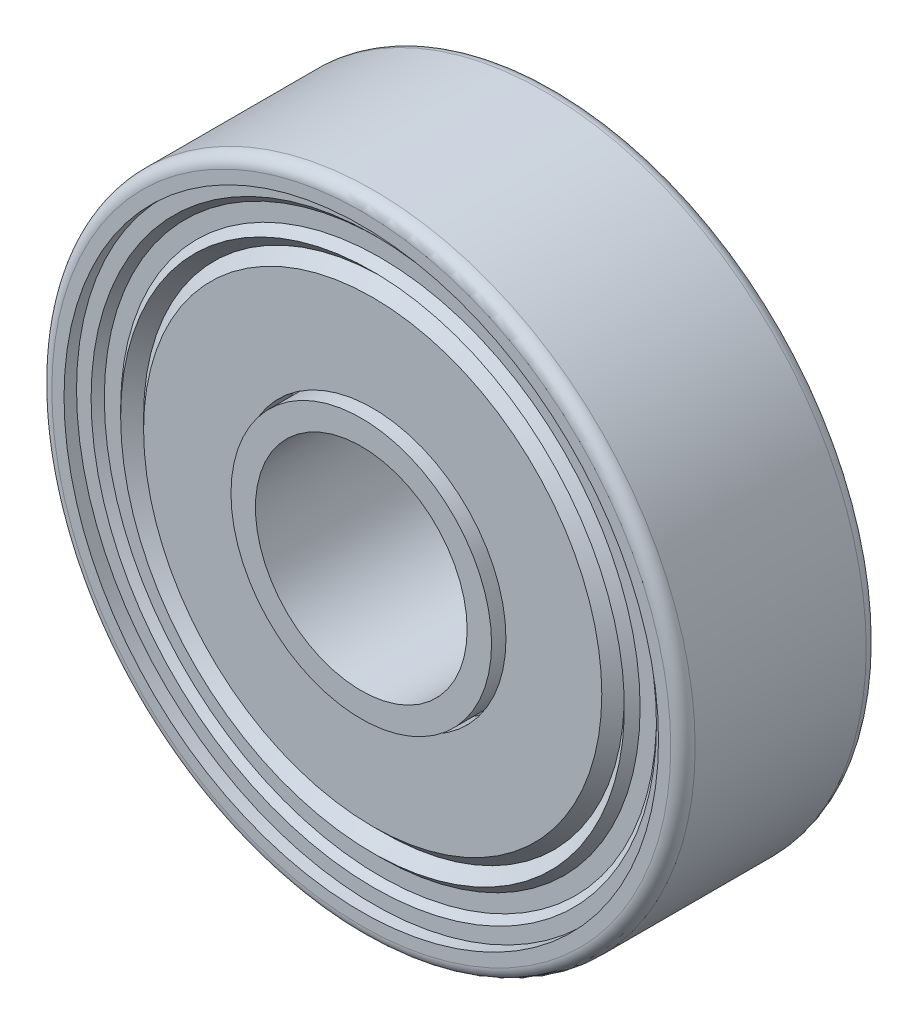
ISO-10303-21;
HEADER;
FILE_DESCRIPTION(('STEP AP214'),'2;1');
FILE_NAME('part.step','',(''),(''),'','','');
FILE_SCHEMA(('AUTOMOTIVE_DESIGN { 1 0 10303 214 1 1 1 1 }'));
ENDSEC;
DATA;
#1=APPLICATION_CONTEXT('core data for automotive mechanical design processes');
#2=APPLICATION_PROTOCOL_DEFINITION('international standard','automotive_design',2000,#1);
#3=PRODUCT_CONTEXT('',#1,'mechanical');
#4=PRODUCT('Part','Part','',(#3));
#5=PRODUCT_RELATED_PRODUCT_CATEGORY('part','',(#4));
#6=PRODUCT_DEFINITION_FORMATION('','',#4);
#7=PRODUCT_DEFINITION_CONTEXT('part definition',#1,'design');
#8=PRODUCT_DEFINITION('design','',#6,#7);
#9=PRODUCT_DEFINITION_SHAPE('','',#8);
#10=(LENGTH_UNIT() NAMED_UNIT(*) SI_UNIT(.MILLI.,.METRE.));
#11=(NAMED_UNIT(*) PLANE_ANGLE_UNIT() SI_UNIT($,.RADIAN.));
#12=(NAMED_UNIT(*) SI_UNIT($,.STERADIAN.) SOLID_ANGLE_UNIT());
#13=UNCERTAINTY_MEASURE_WITH_UNIT(LENGTH_MEASURE(1.E-05),#10,'distance_accuracy_value','');
#14=(GEOMETRIC_REPRESENTATION_CONTEXT(3) GLOBAL_UNCERTAINTY_ASSIGNED_CONTEXT((#13)) GLOBAL_UNIT_ASSIGNED_CONTEXT((#10,
#11,#12)) REPRESENTATION_CONTEXT('',''));
#15=CARTESIAN_POINT('',(0.,0.,0.));
#16=DIRECTION('',(0.,0.,1.));
#17=DIRECTION('',(1.,0.,0.));
#18=AXIS2_PLACEMENT_3D('',#15,#16,#17);
#19=CARTESIAN_POINT('',(0.,0.,0.));
#20=DIRECTION('',(0.,0.,1.));
#21=DIRECTION('',(1.,0.,0.));
#22=AXIS2_PLACEMENT_3D('',#19,#20,#21);
#23=PLANE('',#22);
#24=CARTESIAN_POINT('',(0.,0.,0.));
#25=DIRECTION('',(0.,0.,1.));
#26=DIRECTION('',(1.,0.,0.));
#27=AXIS2_PLACEMENT_3D('',#24,#25,#26);
#28=CIRCLE('',#27,7.6);
#29=CARTESIAN_POINT('',(7.6,0.,0.));
#30=VERTEX_POINT('',#29);
#31=EDGE_CURVE('E10',#30,#30,#28,.F.);
#32=ORIENTED_EDGE('',*,*,#31,.T.);
#33=EDGE_LOOP('',(#32));
#34=FACE_BOUND('',#33,.T.);
#35=CARTESIAN_POINT('',(0.,0.,0.));
#36=DIRECTION('',(0.,0.,1.));
#37=DIRECTION('',(1.,0.,0.));
#38=AXIS2_PLACEMENT_3D('',#35,#36,#37);
#39=CIRCLE('',#38,7.3);
#40=CARTESIAN_POINT('',(7.3,0.,0.));
#41=VERTEX_POINT('',#40);
#42=EDGE_CURVE('E65',#41,#41,#39,.T.);
#43=ORIENTED_EDGE('',*,*,#42,.T.);
#44=EDGE_LOOP('',(#43));
#45=FACE_BOUND('',#44,.T.);
#46=ADVANCED_FACE('F40',(#34,#45),#23,.F.);
#47=CARTESIAN_POINT('',(0.,0.,0.));
#48=DIRECTION('',(0.,0.,1.));
#49=DIRECTION('',(1.,0.,0.));
#50=AXIS2_PLACEMENT_3D('',#47,#48,#49);
#51=CIRCLE('',#50,2.6);
#52=CARTESIAN_POINT('',(2.6,0.,0.));
#53=VERTEX_POINT('',#52);
#54=EDGE_CURVE('E79',#53,#53,#51,.T.);
#55=ORIENTED_EDGE('',*,*,#54,.T.);
#56=EDGE_LOOP('',(#55));
#57=FACE_BOUND('',#56,.T.);
#58=CARTESIAN_POINT('',(0.,0.,0.));
#59=DIRECTION('',(0.,0.,1.));
#60=DIRECTION('',(1.,0.,0.));
#61=AXIS2_PLACEMENT_3D('',#58,#59,#60);
#62=CIRCLE('',#61,3.2);
#63=CARTESIAN_POINT('',(3.2,0.,0.));
#64=VERTEX_POINT('',#63);
#65=EDGE_CURVE('E70',#64,#64,#62,.F.);
#66=ORIENTED_EDGE('',*,*,#65,.T.);
#67=EDGE_LOOP('',(#66));
#68=FACE_BOUND('',#67,.T.);
#69=ADVANCED_FACE('F188',(#57,#68),#23,.F.);
#70=CARTESIAN_POINT('',(0.,0.,4.8));
#71=DIRECTION('',(0.,0.,1.));
#72=DIRECTION('',(1.,0.,0.));
#73=AXIS2_PLACEMENT_3D('',#70,#71,#72);
#74=PLANE('',#73);
#75=CARTESIAN_POINT('',(0.,0.,4.8));
#76=DIRECTION('',(0.,0.,1.));
#77=DIRECTION('',(1.,0.,0.));
#78=AXIS2_PLACEMENT_3D('',#75,#76,#77);
#79=CIRCLE('',#78,7.6);
#80=CARTESIAN_POINT('',(7.6,0.,4.8));
#81=VERTEX_POINT('',#80);
#82=EDGE_CURVE('E58',#81,#81,#79,.T.);
#83=ORIENTED_EDGE('',*,*,#82,.T.);
#84=EDGE_LOOP('',(#83));
#85=FACE_BOUND('',#84,.T.);
#86=CARTESIAN_POINT('',(0.,0.,4.8));
#87=DIRECTION('',(0.,0.,1.));
#88=DIRECTION('',(1.,0.,0.));
#89=AXIS2_PLACEMENT_3D('',#86,#87,#88);
#90=CIRCLE('',#89,7.3);
#91=CARTESIAN_POINT('',(7.3,0.,4.8));
#92=VERTEX_POINT('',#91);
#93=EDGE_CURVE('E75',#92,#92,#90,.T.);
#94=ORIENTED_EDGE('',*,*,#93,.F.);
#95=EDGE_LOOP('',(#94));
#96=FACE_BOUND('',#95,.T.);
#97=ADVANCED_FACE('F194',(#85,#96),#74,.T.);
#98=CARTESIAN_POINT('',(0.,0.,4.8));
#99=DIRECTION('',(0.,0.,1.));
#100=DIRECTION('',(1.,0.,0.));
#101=AXIS2_PLACEMENT_3D('',#98,#99,#100);
#102=CIRCLE('',#101,2.6);
#103=CARTESIAN_POINT('',(2.6,0.,4.8));
#104=VERTEX_POINT('',#103);
#105=EDGE_CURVE('E64',#104,#104,#102,.T.);
#106=ORIENTED_EDGE('',*,*,#105,.F.);
#107=EDGE_LOOP('',(#106));
#108=FACE_BOUND('',#107,.T.);
#109=CARTESIAN_POINT('',(0.,0.,4.8));
#110=DIRECTION('',(0.,0.,1.));
#111=DIRECTION('',(1.,0.,0.));
#112=AXIS2_PLACEMENT_3D('',#109,#110,#111);
#113=CIRCLE('',#112,3.2);
#114=CARTESIAN_POINT('',(3.2,0.,4.8));
#115=VERTEX_POINT('',#114);
#116=EDGE_CURVE('E80',#115,#115,#113,.F.);
#117=ORIENTED_EDGE('',*,*,#116,.F.);
#118=EDGE_LOOP('',(#117));
#119=FACE_BOUND('',#118,.T.);
#120=ADVANCED_FACE('F203',(#108,#119),#74,.T.);
#121=CARTESIAN_POINT('',(0.,0.,4.8));
#122=DIRECTION('',(0.,0.,-1.));
#123=DIRECTION('',(-1.,0.,0.));
#124=AXIS2_PLACEMENT_3D('',#121,#122,#123);
#125=CYLINDRICAL_SURFACE('',#124,7.9);
#126=CARTESIAN_POINT('',(0.,0.,4.5));
#127=DIRECTION('',(0.,0.,1.));
#128=DIRECTION('',(1.,0.,0.));
#129=AXIS2_PLACEMENT_3D('',#126,#127,#128);
#130=CIRCLE('',#129,7.9);
#131=CARTESIAN_POINT('',(7.9,0.,4.5));
#132=VERTEX_POINT('',#131);
#133=EDGE_CURVE('E48',#132,#132,#130,.F.);
#134=ORIENTED_EDGE('',*,*,#133,.T.);
#135=EDGE_LOOP('',(#134));
#136=FACE_BOUND('',#135,.T.);
#137=CARTESIAN_POINT('',(0.,0.,0.3));
#138=DIRECTION('',(0.,0.,1.));
#139=DIRECTION('',(1.,0.,0.));
#140=AXIS2_PLACEMENT_3D('',#137,#138,#139);
#141=CIRCLE('',#140,7.9);
#142=CARTESIAN_POINT('',(7.9,0.,0.3));
#143=VERTEX_POINT('',#142);
#144=EDGE_CURVE('E53',#143,#143,#141,.T.);
#145=ORIENTED_EDGE('',*,*,#144,.T.);
#146=EDGE_LOOP('',(#145));
#147=FACE_BOUND('',#146,.T.);
#148=ADVANCED_FACE('F200',(#136,#147),#125,.T.);
#149=CARTESIAN_POINT('',(0.,0.,4.8));
#150=DIRECTION('',(0.,0.,-1.));
#151=DIRECTION('',(-1.,0.,0.));
#152=AXIS2_PLACEMENT_3D('',#149,#150,#151);
#153=CYLINDRICAL_SURFACE('',#152,2.6);
#154=ORIENTED_EDGE('',*,*,#105,.T.);
#155=EDGE_LOOP('',(#154));
#156=FACE_BOUND('',#155,.T.);
#157=ORIENTED_EDGE('',*,*,#54,.F.);
#158=EDGE_LOOP('',(#157));
#159=FACE_BOUND('',#158,.T.);
#160=ADVANCED_FACE('F202',(#156,#159),#153,.F.);
#161=CARTESIAN_POINT('',(0.,0.,4.87973216310469));
#162=DIRECTION('',(0.,0.,-1.));
#163=DIRECTION('',(-1.,0.,0.));
#164=AXIS2_PLACEMENT_3D('',#161,#162,#163);
#165=CYLINDRICAL_SURFACE('',#164,7.3);
#166=ORIENTED_EDGE('',*,*,#93,.T.);
#167=EDGE_LOOP('',(#166));
#168=FACE_BOUND('',#167,.T.);
#169=CARTESIAN_POINT('',(0.,0.,4.49295622621438));
#170=DIRECTION('',(0.,0.,-1.));
#171=DIRECTION('',(-1.,0.,0.));
#172=AXIS2_PLACEMENT_3D('',#169,#170,#171);
#173=CIRCLE('',#172,7.3);
#174=CARTESIAN_POINT('',(-7.3,0.,4.49295622621438));
#175=VERTEX_POINT('',#174);
#176=EDGE_CURVE('E84',#175,#175,#173,.T.);
#177=ORIENTED_EDGE('',*,*,#176,.T.);
#178=EDGE_LOOP('',(#177));
#179=FACE_BOUND('',#178,.T.);
#180=ADVANCED_FACE('F208',(#168,#179),#165,.F.);
#181=CARTESIAN_POINT('',(0.,7.3,4.49295622621438));
#182=DIRECTION('',(0.,0.,-1.));
#183=DIRECTION('',(-1.,0.,0.));
#184=AXIS2_PLACEMENT_3D('',#181,#182,#183);
#185=PLANE('',#184);
#186=ORIENTED_EDGE('',*,*,#176,.F.);
#187=EDGE_LOOP('',(#186));
#188=FACE_BOUND('',#187,.T.);
#189=CARTESIAN_POINT('',(0.,0.,4.49295622621438));
#190=DIRECTION('',(0.,0.,-1.));
#191=DIRECTION('',(-1.,0.,0.));
#192=AXIS2_PLACEMENT_3D('',#189,#190,#191);
#193=CIRCLE('',#192,6.94265262737443);
#194=CARTESIAN_POINT('',(-6.94265262737443,0.,4.49295622621438));
#195=VERTEX_POINT('',#194);
#196=EDGE_CURVE('E94',#195,#195,#193,.T.);
#197=ORIENTED_EDGE('',*,*,#196,.T.);
#198=EDGE_LOOP('',(#197));
#199=FACE_BOUND('',#198,.T.);
#200=ADVANCED_FACE('F446',(#188,#199),#185,.F.);
#201=CARTESIAN_POINT('',(0.,0.,4.33057613093863));
#202=DIRECTION('',(0.,0.,1.));
#203=DIRECTION('',(1.,0.,0.));
#204=AXIS2_PLACEMENT_3D('',#201,#202,#203);
#205=CONICAL_SURFACE('',#204,6.78027253209868,0.785398163397448);
#206=ORIENTED_EDGE('',*,*,#196,.F.);
#207=EDGE_LOOP('',(#206));
#208=FACE_BOUND('',#207,.T.);
#209=CARTESIAN_POINT('',(0.,0.,4.33057613093863));
#210=DIRECTION('',(0.,0.,-1.));
#211=DIRECTION('',(-1.,0.,0.));
#212=AXIS2_PLACEMENT_3D('',#209,#210,#211);
#213=CIRCLE('',#212,6.78027253209868);
#214=CARTESIAN_POINT('',(-6.78027253209868,0.,4.33057613093863));
#215=VERTEX_POINT('',#214);
#216=EDGE_CURVE('E98',#215,#215,#213,.T.);
#217=ORIENTED_EDGE('',*,*,#216,.T.);
#218=EDGE_LOOP('',(#217));
#219=FACE_BOUND('',#218,.T.);
#220=ADVANCED_FACE('F435',(#208,#219),#205,.F.);
#221=CARTESIAN_POINT('',(0.,6.78027253209868,4.33057613093863));
#222=DIRECTION('',(0.,0.,-1.));
#223=DIRECTION('',(-1.,0.,0.));
#224=AXIS2_PLACEMENT_3D('',#221,#222,#223);
#225=PLANE('',#224);
#226=ORIENTED_EDGE('',*,*,#216,.F.);
#227=EDGE_LOOP('',(#226));
#228=FACE_BOUND('',#227,.T.);
#229=CARTESIAN_POINT('',(0.,0.,4.33057613093863));
#230=DIRECTION('',(0.,0.,-1.));
#231=DIRECTION('',(-1.,0.,0.));
#232=AXIS2_PLACEMENT_3D('',#229,#230,#231);
#233=CIRCLE('',#232,6.37895832394229);
#234=CARTESIAN_POINT('',(-6.37895832394229,0.,4.33057613093863));
#235=VERTEX_POINT('',#234);
#236=EDGE_CURVE('E102',#235,#235,#233,.T.);
#237=ORIENTED_EDGE('',*,*,#236,.T.);
#238=EDGE_LOOP('',(#237));
#239=FACE_BOUND('',#238,.T.);
#240=ADVANCED_FACE('F424',(#228,#239),#225,.F.);
#241=CARTESIAN_POINT('',(0.,0.,4.52407841678198));
#242=DIRECTION('',(0.,0.,-1.));
#243=DIRECTION('',(-1.,0.,0.));
#244=AXIS2_PLACEMENT_3D('',#241,#242,#243);
#245=CONICAL_SURFACE('',#244,6.18545603809894,0.785398163397448);
#246=ORIENTED_EDGE('',*,*,#236,.F.);
#247=EDGE_LOOP('',(#246));
#248=FACE_BOUND('',#247,.T.);
#249=CARTESIAN_POINT('',(0.,0.,4.52407841678198));
#250=DIRECTION('',(0.,0.,-1.));
#251=DIRECTION('',(-1.,0.,0.));
#252=AXIS2_PLACEMENT_3D('',#249,#250,#251);
#253=CIRCLE('',#252,6.18545603809894);
#254=CARTESIAN_POINT('',(-6.18545603809894,0.,4.52407841678198));
#255=VERTEX_POINT('',#254);
#256=EDGE_CURVE('E106',#255,#255,#253,.T.);
#257=ORIENTED_EDGE('',*,*,#256,.T.);
#258=EDGE_LOOP('',(#257));
#259=FACE_BOUND('',#258,.T.);
#260=ADVANCED_FACE('F413',(#248,#259),#245,.T.);
#261=CARTESIAN_POINT('',(0.,0.,4.24238655349189));
#262=DIRECTION('',(0.,0.,1.));
#263=DIRECTION('',(1.,0.,0.));
#264=AXIS2_PLACEMENT_3D('',#261,#262,#263);
#265=CONICAL_SURFACE('',#264,5.90376417480886,0.785398163397448);
#266=ORIENTED_EDGE('',*,*,#256,.F.);
#267=EDGE_LOOP('',(#266));
#268=FACE_BOUND('',#267,.T.);
#269=CARTESIAN_POINT('',(0.,0.,4.24238655349189));
#270=DIRECTION('',(0.,0.,-1.));
#271=DIRECTION('',(-1.,0.,0.));
#272=AXIS2_PLACEMENT_3D('',#269,#270,#271);
#273=CIRCLE('',#272,5.90376417480886);
#274=CARTESIAN_POINT('',(-5.90376417480886,0.,4.24238655349189));
#275=VERTEX_POINT('',#274);
#276=EDGE_CURVE('E110',#275,#275,#273,.T.);
#277=ORIENTED_EDGE('',*,*,#276,.T.);
#278=EDGE_LOOP('',(#277));
#279=FACE_BOUND('',#278,.T.);
#280=ADVANCED_FACE('F402',(#268,#279),#265,.F.);
#281=CARTESIAN_POINT('',(0.,0.,4.51962984693023));
#282=DIRECTION('',(0.,0.,-1.));
#283=DIRECTION('',(-1.,0.,0.));
#284=AXIS2_PLACEMENT_3D('',#281,#282,#283);
#285=CONICAL_SURFACE('',#284,5.62652088137051,0.78539816339745);
#286=ORIENTED_EDGE('',*,*,#276,.F.);
#287=EDGE_LOOP('',(#286));
#288=FACE_BOUND('',#287,.T.);
#289=CARTESIAN_POINT('',(0.,0.,4.51962984693023));
#290=DIRECTION('',(0.,0.,-1.));
#291=DIRECTION('',(-1.,0.,0.));
#292=AXIS2_PLACEMENT_3D('',#289,#290,#291);
#293=CIRCLE('',#292,5.62652088137051);
#294=CARTESIAN_POINT('',(-5.62652088137051,0.,4.51962984693023));
#295=VERTEX_POINT('',#294);
#296=EDGE_CURVE('E114',#295,#295,#293,.T.);
#297=ORIENTED_EDGE('',*,*,#296,.T.);
#298=EDGE_LOOP('',(#297));
#299=FACE_BOUND('',#298,.T.);
#300=ADVANCED_FACE('F391',(#288,#299),#285,.T.);
#301=CARTESIAN_POINT('',(0.,5.62652088137051,4.51962984693023));
#302=DIRECTION('',(0.,0.,-1.));
#303=DIRECTION('',(-1.,0.,0.));
#304=AXIS2_PLACEMENT_3D('',#301,#302,#303);
#305=PLANE('',#304);
#306=ORIENTED_EDGE('',*,*,#296,.F.);
#307=EDGE_LOOP('',(#306));
#308=FACE_BOUND('',#307,.T.);
#309=CARTESIAN_POINT('',(0.,0.,4.51962984693023));
#310=DIRECTION('',(0.,0.,-1.));
#311=DIRECTION('',(-1.,0.,0.));
#312=AXIS2_PLACEMENT_3D('',#309,#310,#311);
#313=CIRCLE('',#312,3.27293966677261);
#314=CARTESIAN_POINT('',(-3.27293966677261,0.,4.51962984693023));
#315=VERTEX_POINT('',#314);
#316=EDGE_CURVE('E118',#315,#315,#313,.T.);
#317=ORIENTED_EDGE('',*,*,#316,.T.);
#318=EDGE_LOOP('',(#317));
#319=FACE_BOUND('',#318,.T.);
#320=ADVANCED_FACE('F380',(#308,#319),#305,.F.);
#321=CARTESIAN_POINT('',(0.,0.,4.87973216310469));
#322=DIRECTION('',(0.,0.,-1.));
#323=DIRECTION('',(-1.,0.,0.));
#324=AXIS2_PLACEMENT_3D('',#321,#322,#323);
#325=CYLINDRICAL_SURFACE('',#324,3.27293966677261);
#326=ORIENTED_EDGE('',*,*,#316,.F.);
#327=EDGE_LOOP('',(#326));
#328=FACE_BOUND('',#327,.T.);
#329=CARTESIAN_POINT('',(0.,0.,3.81743033039006));
#330=DIRECTION('',(0.,0.,-1.));
#331=DIRECTION('',(-1.,0.,0.));
#332=AXIS2_PLACEMENT_3D('',#329,#330,#331);
#333=CIRCLE('',#332,3.27293966677261);
#334=CARTESIAN_POINT('',(-3.27293966677261,0.,3.81743033039006));
#335=VERTEX_POINT('',#334);
#336=EDGE_CURVE('E122',#335,#335,#333,.T.);
#337=ORIENTED_EDGE('',*,*,#336,.T.);
#338=EDGE_LOOP('',(#337));
#339=FACE_BOUND('',#338,.T.);
#340=ADVANCED_FACE('F369',(#328,#339),#325,.F.);
#341=CARTESIAN_POINT('',(0.,3.27293966677261,3.81743033039006));
#342=DIRECTION('',(0.,0.,-1.));
#343=DIRECTION('',(-1.,0.,0.));
#344=AXIS2_PLACEMENT_3D('',#341,#342,#343);
#345=PLANE('',#344);
#346=ORIENTED_EDGE('',*,*,#336,.F.);
#347=EDGE_LOOP('',(#346));
#348=FACE_BOUND('',#347,.T.);
#349=CARTESIAN_POINT('',(0.,0.,3.81743033039006));
#350=DIRECTION('',(0.,0.,-1.));
#351=DIRECTION('',(-1.,0.,0.));
#352=AXIS2_PLACEMENT_3D('',#349,#350,#351);
#353=CIRCLE('',#352,3.2);
#354=CARTESIAN_POINT('',(-3.2,0.,3.81743033039006));
#355=VERTEX_POINT('',#354);
#356=EDGE_CURVE('E69',#355,#355,#353,.T.);
#357=ORIENTED_EDGE('',*,*,#356,.T.);
#358=EDGE_LOOP('',(#357));
#359=FACE_BOUND('',#358,.T.);
#360=ADVANCED_FACE('F359',(#348,#359),#345,.F.);
#361=CARTESIAN_POINT('',(0.,0.,4.87973216310469));
#362=DIRECTION('',(0.,0.,-1.));
#363=DIRECTION('',(-1.,0.,0.));
#364=AXIS2_PLACEMENT_3D('',#361,#362,#363);
#365=CYLINDRICAL_SURFACE('',#364,3.2);
#366=ORIENTED_EDGE('',*,*,#116,.T.);
#367=EDGE_LOOP('',(#366));
#368=FACE_BOUND('',#367,.T.);
#369=ORIENTED_EDGE('',*,*,#356,.F.);
#370=EDGE_LOOP('',(#369));
#371=FACE_BOUND('',#370,.T.);
#372=ADVANCED_FACE('F337',(#368,#371),#365,.T.);
#373=CARTESIAN_POINT('',(0.,0.,-0.0797321631046876));
#374=DIRECTION('',(0.,0.,1.));
#375=DIRECTION('',(-1.,0.,0.));
#376=AXIS2_PLACEMENT_3D('',#373,#374,#375);
#377=CYLINDRICAL_SURFACE('',#376,7.3);
#378=CARTESIAN_POINT('',(0.,0.,0.307043773785621));
#379=DIRECTION('',(0.,0.,-1.));
#380=DIRECTION('',(-1.,0.,0.));
#381=AXIS2_PLACEMENT_3D('',#378,#379,#380);
#382=CIRCLE('',#381,7.3);
#383=CARTESIAN_POINT('',(-7.3,0.,0.307043773785621));
#384=VERTEX_POINT('',#383);
#385=EDGE_CURVE('E74',#384,#384,#382,.T.);
#386=ORIENTED_EDGE('',*,*,#385,.F.);
#387=EDGE_LOOP('',(#386));
#388=FACE_BOUND('',#387,.T.);
#389=ORIENTED_EDGE('',*,*,#42,.F.);
#390=EDGE_LOOP('',(#389));
#391=FACE_BOUND('',#390,.T.);
#392=ADVANCED_FACE('F328',(#388,#391),#377,.F.);
#393=CARTESIAN_POINT('',(0.,0.,-0.0797321631046876));
#394=DIRECTION('',(0.,0.,1.));
#395=DIRECTION('',(-1.,0.,0.));
#396=AXIS2_PLACEMENT_3D('',#393,#394,#395);
#397=CYLINDRICAL_SURFACE('',#396,3.2);
#398=CARTESIAN_POINT('',(0.,0.,0.982569669609943));
#399=DIRECTION('',(0.,0.,-1.));
#400=DIRECTION('',(-1.,0.,0.));
#401=AXIS2_PLACEMENT_3D('',#398,#399,#400);
#402=CIRCLE('',#401,3.2);
#403=CARTESIAN_POINT('',(-3.2,0.,0.982569669609943));
#404=VERTEX_POINT('',#403);
#405=EDGE_CURVE('E164',#404,#404,#402,.T.);
#406=ORIENTED_EDGE('',*,*,#405,.T.);
#407=EDGE_LOOP('',(#406));
#408=FACE_BOUND('',#407,.T.);
#409=ORIENTED_EDGE('',*,*,#65,.F.);
#410=EDGE_LOOP('',(#409));
#411=FACE_BOUND('',#410,.T.);
#412=ADVANCED_FACE('F169',(#408,#411),#397,.T.);
#413=CARTESIAN_POINT('',(0.,7.3,0.307043773785621));
#414=DIRECTION('',(0.,0.,1.));
#415=DIRECTION('',(-1.,0.,0.));
#416=AXIS2_PLACEMENT_3D('',#413,#414,#415);
#417=PLANE('',#416);
#418=ORIENTED_EDGE('',*,*,#385,.T.);
#419=EDGE_LOOP('',(#418));
#420=FACE_BOUND('',#419,.T.);
#421=CARTESIAN_POINT('',(0.,0.,0.307043773785621));
#422=DIRECTION('',(0.,0.,-1.));
#423=DIRECTION('',(-1.,0.,0.));
#424=AXIS2_PLACEMENT_3D('',#421,#422,#423);
#425=CIRCLE('',#424,6.94265262737443);
#426=CARTESIAN_POINT('',(-6.94265262737443,0.,0.307043773785621));
#427=VERTEX_POINT('',#426);
#428=EDGE_CURVE('E132',#427,#427,#425,.T.);
#429=ORIENTED_EDGE('',*,*,#428,.F.);
#430=EDGE_LOOP('',(#429));
#431=FACE_BOUND('',#430,.T.);
#432=ADVANCED_FACE('F307',(#420,#431),#417,.F.);
#433=CARTESIAN_POINT('',(0.,0.,0.469423869061368));
#434=DIRECTION('',(0.,0.,-1.));
#435=DIRECTION('',(1.,0.,0.));
#436=AXIS2_PLACEMENT_3D('',#433,#434,#435);
#437=CONICAL_SURFACE('',#436,6.78027253209868,0.785398163397448);
#438=ORIENTED_EDGE('',*,*,#428,.T.);
#439=EDGE_LOOP('',(#438));
#440=FACE_BOUND('',#439,.T.);
#441=CARTESIAN_POINT('',(0.,0.,0.469423869061368));
#442=DIRECTION('',(0.,0.,-1.));
#443=DIRECTION('',(-1.,0.,0.));
#444=AXIS2_PLACEMENT_3D('',#441,#442,#443);
#445=CIRCLE('',#444,6.78027253209868);
#446=CARTESIAN_POINT('',(-6.78027253209868,0.,0.469423869061368));
#447=VERTEX_POINT('',#446);
#448=EDGE_CURVE('E136',#447,#447,#445,.T.);
#449=ORIENTED_EDGE('',*,*,#448,.F.);
#450=EDGE_LOOP('',(#449));
#451=FACE_BOUND('',#450,.T.);
#452=ADVANCED_FACE('F296',(#440,#451),#437,.F.);
#453=CARTESIAN_POINT('',(0.,6.78027253209868,0.469423869061368));
#454=DIRECTION('',(0.,0.,1.));
#455=DIRECTION('',(-1.,0.,0.));
#456=AXIS2_PLACEMENT_3D('',#453,#454,#455);
#457=PLANE('',#456);
#458=ORIENTED_EDGE('',*,*,#448,.T.);
#459=EDGE_LOOP('',(#458));
#460=FACE_BOUND('',#459,.T.);
#461=CARTESIAN_POINT('',(0.,0.,0.469423869061368));
#462=DIRECTION('',(0.,0.,-1.));
#463=DIRECTION('',(-1.,0.,0.));
#464=AXIS2_PLACEMENT_3D('',#461,#462,#463);
#465=CIRCLE('',#464,6.37895832394229);
#466=CARTESIAN_POINT('',(-6.37895832394229,0.,0.469423869061368));
#467=VERTEX_POINT('',#466);
#468=EDGE_CURVE('E140',#467,#467,#465,.T.);
#469=ORIENTED_EDGE('',*,*,#468,.F.);
#470=EDGE_LOOP('',(#469));
#471=FACE_BOUND('',#470,.T.);
#472=ADVANCED_FACE('F285',(#460,#471),#457,.F.);
#473=CARTESIAN_POINT('',(0.,0.,0.275921583218019));
#474=DIRECTION('',(0.,0.,1.));
#475=DIRECTION('',(-1.,0.,0.));
#476=AXIS2_PLACEMENT_3D('',#473,#474,#475);
#477=CONICAL_SURFACE('',#476,6.18545603809894,0.785398163397448);
#478=ORIENTED_EDGE('',*,*,#468,.T.);
#479=EDGE_LOOP('',(#478));
#480=FACE_BOUND('',#479,.T.);
#481=CARTESIAN_POINT('',(0.,0.,0.275921583218019));
#482=DIRECTION('',(0.,0.,-1.));
#483=DIRECTION('',(-1.,0.,0.));
#484=AXIS2_PLACEMENT_3D('',#481,#482,#483);
#485=CIRCLE('',#484,6.18545603809894);
#486=CARTESIAN_POINT('',(-6.18545603809894,0.,0.275921583218019));
#487=VERTEX_POINT('',#486);
#488=EDGE_CURVE('E144',#487,#487,#485,.T.);
#489=ORIENTED_EDGE('',*,*,#488,.F.);
#490=EDGE_LOOP('',(#489));
#491=FACE_BOUND('',#490,.T.);
#492=ADVANCED_FACE('F274',(#480,#491),#477,.T.);
#493=CARTESIAN_POINT('',(0.,0.,0.557613446508106));
#494=DIRECTION('',(0.,0.,-1.));
#495=DIRECTION('',(1.,0.,0.));
#496=AXIS2_PLACEMENT_3D('',#493,#494,#495);
#497=CONICAL_SURFACE('',#496,5.90376417480886,0.785398163397448);
#498=ORIENTED_EDGE('',*,*,#488,.T.);
#499=EDGE_LOOP('',(#498));
#500=FACE_BOUND('',#499,.T.);
#501=CARTESIAN_POINT('',(0.,0.,0.557613446508106));
#502=DIRECTION('',(0.,0.,-1.));
#503=DIRECTION('',(-1.,0.,0.));
#504=AXIS2_PLACEMENT_3D('',#501,#502,#503);
#505=CIRCLE('',#504,5.90376417480886);
#506=CARTESIAN_POINT('',(-5.90376417480886,0.,0.557613446508106));
#507=VERTEX_POINT('',#506);
#508=EDGE_CURVE('E148',#507,#507,#505,.T.);
#509=ORIENTED_EDGE('',*,*,#508,.F.);
#510=EDGE_LOOP('',(#509));
#511=FACE_BOUND('',#510,.T.);
#512=ADVANCED_FACE('F263',(#500,#511),#497,.F.);
#513=CARTESIAN_POINT('',(0.,0.,0.280370153069765));
#514=DIRECTION('',(0.,0.,1.));
#515=DIRECTION('',(-1.,0.,0.));
#516=AXIS2_PLACEMENT_3D('',#513,#514,#515);
#517=CONICAL_SURFACE('',#516,5.62652088137051,0.78539816339745);
#518=ORIENTED_EDGE('',*,*,#508,.T.);
#519=EDGE_LOOP('',(#518));
#520=FACE_BOUND('',#519,.T.);
#521=CARTESIAN_POINT('',(0.,0.,0.280370153069765));
#522=DIRECTION('',(0.,0.,-1.));
#523=DIRECTION('',(-1.,0.,0.));
#524=AXIS2_PLACEMENT_3D('',#521,#522,#523);
#525=CIRCLE('',#524,5.62652088137051);
#526=CARTESIAN_POINT('',(-5.62652088137051,0.,0.280370153069765));
#527=VERTEX_POINT('',#526);
#528=EDGE_CURVE('E152',#527,#527,#525,.T.);
#529=ORIENTED_EDGE('',*,*,#528,.F.);
#530=EDGE_LOOP('',(#529));
#531=FACE_BOUND('',#530,.T.);
#532=ADVANCED_FACE('F252',(#520,#531),#517,.T.);
#533=CARTESIAN_POINT('',(0.,5.62652088137051,0.280370153069765));
#534=DIRECTION('',(0.,0.,1.));
#535=DIRECTION('',(-1.,0.,0.));
#536=AXIS2_PLACEMENT_3D('',#533,#534,#535);
#537=PLANE('',#536);
#538=ORIENTED_EDGE('',*,*,#528,.T.);
#539=EDGE_LOOP('',(#538));
#540=FACE_BOUND('',#539,.T.);
#541=CARTESIAN_POINT('',(0.,0.,0.280370153069765));
#542=DIRECTION('',(0.,0.,-1.));
#543=DIRECTION('',(-1.,0.,0.));
#544=AXIS2_PLACEMENT_3D('',#541,#542,#543);
#545=CIRCLE('',#544,3.27293966677261);
#546=CARTESIAN_POINT('',(-3.27293966677261,0.,0.280370153069765));
#547=VERTEX_POINT('',#546);
#548=EDGE_CURVE('E156',#547,#547,#545,.T.);
#549=ORIENTED_EDGE('',*,*,#548,.F.);
#550=EDGE_LOOP('',(#549));
#551=FACE_BOUND('',#550,.T.);
#552=ADVANCED_FACE('F183',(#540,#551),#537,.F.);
#553=CARTESIAN_POINT('',(0.,0.,-0.0797321631046876));
#554=DIRECTION('',(0.,0.,1.));
#555=DIRECTION('',(-1.,0.,0.));
#556=AXIS2_PLACEMENT_3D('',#553,#554,#555);
#557=CYLINDRICAL_SURFACE('',#556,3.27293966677261);
#558=ORIENTED_EDGE('',*,*,#548,.T.);
#559=EDGE_LOOP('',(#558));
#560=FACE_BOUND('',#559,.T.);
#561=CARTESIAN_POINT('',(0.,0.,0.982569669609943));
#562=DIRECTION('',(0.,0.,-1.));
#563=DIRECTION('',(-1.,0.,0.));
#564=AXIS2_PLACEMENT_3D('',#561,#562,#563);
#565=CIRCLE('',#564,3.27293966677261);
#566=CARTESIAN_POINT('',(-3.27293966677261,0.,0.982569669609943));
#567=VERTEX_POINT('',#566);
#568=EDGE_CURVE('E160',#567,#567,#565,.T.);
#569=ORIENTED_EDGE('',*,*,#568,.F.);
#570=EDGE_LOOP('',(#569));
#571=FACE_BOUND('',#570,.T.);
#572=ADVANCED_FACE('F175',(#560,#571),#557,.F.);
#573=CARTESIAN_POINT('',(0.,3.27293966677261,0.982569669609943));
#574=DIRECTION('',(0.,0.,1.));
#575=DIRECTION('',(-1.,0.,0.));
#576=AXIS2_PLACEMENT_3D('',#573,#574,#575);
#577=PLANE('',#576);
#578=ORIENTED_EDGE('',*,*,#568,.T.);
#579=EDGE_LOOP('',(#578));
#580=FACE_BOUND('',#579,.T.);
#581=ORIENTED_EDGE('',*,*,#405,.F.);
#582=EDGE_LOOP('',(#581));
#583=FACE_BOUND('',#582,.T.);
#584=ADVANCED_FACE('F172',(#580,#583),#577,.F.);
#585=CARTESIAN_POINT('',(0.,0.,4.5));
#586=DIRECTION('',(0.,0.,1.));
#587=DIRECTION('',(1.,0.,0.));
#588=AXIS2_PLACEMENT_3D('',#585,#586,#587);
#589=TOROIDAL_SURFACE('',#588,7.6,0.3);
#590=ORIENTED_EDGE('',*,*,#133,.F.);
#591=EDGE_LOOP('',(#590));
#592=FACE_BOUND('',#591,.T.);
#593=ORIENTED_EDGE('',*,*,#82,.F.);
#594=EDGE_LOOP('',(#593));
#595=FACE_BOUND('',#594,.T.);
#596=ADVANCED_FACE('F174',(#592,#595),#589,.T.);
#597=CARTESIAN_POINT('',(0.,0.,0.3));
#598=DIRECTION('',(0.,0.,1.));
#599=DIRECTION('',(1.,0.,0.));
#600=AXIS2_PLACEMENT_3D('',#597,#598,#599);
#601=TOROIDAL_SURFACE('',#600,7.6,0.3);
#602=ORIENTED_EDGE('',*,*,#31,.F.);
#603=EDGE_LOOP('',(#602));
#604=FACE_BOUND('',#603,.T.);
#605=ORIENTED_EDGE('',*,*,#144,.F.);
#606=EDGE_LOOP('',(#605));
#607=FACE_BOUND('',#606,.T.);
#608=ADVANCED_FACE('F42',(#604,#607),#601,.T.);
#609=CLOSED_SHELL('',(#46,#69,#97,#120,#148,#160,#180,#200,#220,#240,#260,#280,#300,#320,#340,
#360,#372,#392,#412,#432,#452,#472,#492,#512,#532,#552,#572,#584,#596,#608));
#610=MANIFOLD_SOLID_BREP('B2',#609);
#611=ADVANCED_BREP_SHAPE_REPRESENTATION('',(#18,#610),#14);
#612=SHAPE_DEFINITION_REPRESENTATION(#9,#611);
ENDSEC;
END-ISO-10303-21;
